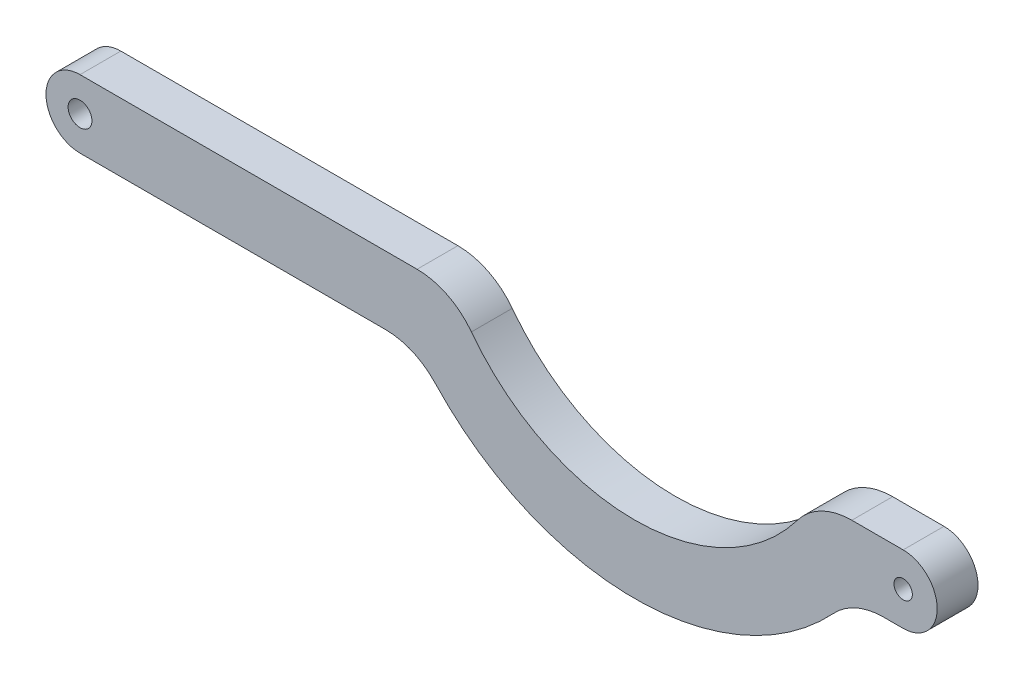
ISO-10303-21;
HEADER;
FILE_DESCRIPTION(('STEP AP214'),'2;1');
FILE_NAME('part.step','',(''),(''),'','','');
FILE_SCHEMA(('AUTOMOTIVE_DESIGN { 1 0 10303 214 1 1 1 1 }'));
ENDSEC;
DATA;
#1=APPLICATION_CONTEXT('core data for automotive mechanical design processes');
#2=APPLICATION_PROTOCOL_DEFINITION('international standard','automotive_design',2000,#1);
#3=PRODUCT_CONTEXT('',#1,'mechanical');
#4=PRODUCT('Part','Part','',(#3));
#5=PRODUCT_RELATED_PRODUCT_CATEGORY('part','',(#4));
#6=PRODUCT_DEFINITION_FORMATION('','',#4);
#7=PRODUCT_DEFINITION_CONTEXT('part definition',#1,'design');
#8=PRODUCT_DEFINITION('design','',#6,#7);
#9=PRODUCT_DEFINITION_SHAPE('','',#8);
#10=(LENGTH_UNIT() NAMED_UNIT(*) SI_UNIT(.MILLI.,.METRE.));
#11=(NAMED_UNIT(*) PLANE_ANGLE_UNIT() SI_UNIT($,.RADIAN.));
#12=(NAMED_UNIT(*) SI_UNIT($,.STERADIAN.) SOLID_ANGLE_UNIT());
#13=UNCERTAINTY_MEASURE_WITH_UNIT(LENGTH_MEASURE(1.E-05),#10,'distance_accuracy_value','');
#14=(GEOMETRIC_REPRESENTATION_CONTEXT(3) GLOBAL_UNCERTAINTY_ASSIGNED_CONTEXT((#13)) GLOBAL_UNIT_ASSIGNED_CONTEXT((#10,
#11,#12)) REPRESENTATION_CONTEXT('',''));
#15=CARTESIAN_POINT('',(0.,0.,0.));
#16=DIRECTION('',(0.,0.,1.));
#17=DIRECTION('',(1.,0.,0.));
#18=AXIS2_PLACEMENT_3D('',#15,#16,#17);
#19=CARTESIAN_POINT('',(0.,5.,6.));
#20=DIRECTION('',(0.,0.,1.));
#21=DIRECTION('',(1.,0.,0.));
#22=AXIS2_PLACEMENT_3D('',#19,#20,#21);
#23=PLANE('',#22);
#24=CARTESIAN_POINT('',(0.,5.,6.));
#25=DIRECTION('',(0.,0.,1.));
#26=DIRECTION('',(1.,0.,0.));
#27=AXIS2_PLACEMENT_3D('',#24,#25,#26);
#28=CIRCLE('',#27,1.75);
#29=CARTESIAN_POINT('',(1.75,5.,6.));
#30=VERTEX_POINT('',#29);
#31=EDGE_CURVE('E254',#30,#30,#28,.T.);
#32=ORIENTED_EDGE('',*,*,#31,.F.);
#33=EDGE_LOOP('',(#32));
#34=FACE_BOUND('',#33,.T.);
#35=DIRECTION('',(-1.,0.,0.));
#36=VECTOR('',#35,1.);
#37=CARTESIAN_POINT('',(108.,10.,6.));
#38=LINE('',#37,#36);
#39=CARTESIAN_POINT('',(121.,10.,6.));
#40=VERTEX_POINT('',#39);
#41=CARTESIAN_POINT('',(113.453134084022,10.,6.));
#42=VERTEX_POINT('',#41);
#43=EDGE_CURVE('E244',#40,#42,#38,.T.);
#44=ORIENTED_EDGE('',*,*,#43,.T.);
#45=CARTESIAN_POINT('',(113.453134084022,0.,6.));
#46=DIRECTION('',(0.,0.,1.));
#47=DIRECTION('',(1.,0.,0.));
#48=AXIS2_PLACEMENT_3D('',#45,#46,#47);
#49=CIRCLE('',#48,10.);
#50=CARTESIAN_POINT('',(105.464850563017,6.01559027760632,6.));
#51=VERTEX_POINT('',#50);
#52=EDGE_CURVE('E193',#42,#51,#49,.T.);
#53=ORIENTED_EDGE('',*,*,#52,.T.);
#54=CARTESIAN_POINT('',(81.5,24.0623611104252,6.));
#55=DIRECTION('',(0.,0.,-1.));
#56=DIRECTION('',(1.,0.,0.));
#57=AXIS2_PLACEMENT_3D('',#54,#55,#56);
#58=CIRCLE('',#57,30.);
#59=CARTESIAN_POINT('',(57.5351494369834,6.01559027760631,6.));
#60=VERTEX_POINT('',#59);
#61=EDGE_CURVE('E247',#51,#60,#58,.T.);
#62=ORIENTED_EDGE('',*,*,#61,.T.);
#63=CARTESIAN_POINT('',(49.5468659159779,0.,6.));
#64=DIRECTION('',(0.,0.,1.));
#65=DIRECTION('',(1.,0.,0.));
#66=AXIS2_PLACEMENT_3D('',#63,#64,#65);
#67=CIRCLE('',#66,10.);
#68=CARTESIAN_POINT('',(49.5468659159779,10.,6.));
#69=VERTEX_POINT('',#68);
#70=EDGE_CURVE('E57',#60,#69,#67,.T.);
#71=ORIENTED_EDGE('',*,*,#70,.T.);
#72=DIRECTION('',(-1.,0.,0.));
#73=VECTOR('',#72,1.);
#74=CARTESIAN_POINT('',(0.,10.,6.));
#75=LINE('',#74,#73);
#76=CARTESIAN_POINT('',(0.,10.,6.));
#77=VERTEX_POINT('',#76);
#78=EDGE_CURVE('E148',#69,#77,#75,.T.);
#79=ORIENTED_EDGE('',*,*,#78,.T.);
#80=CARTESIAN_POINT('',(0.,5.,6.));
#81=DIRECTION('',(0.,0.,1.));
#82=DIRECTION('',(1.,0.,0.));
#83=AXIS2_PLACEMENT_3D('',#80,#81,#82);
#84=CIRCLE('',#83,5.);
#85=CARTESIAN_POINT('',(0.,0.,6.));
#86=VERTEX_POINT('',#85);
#87=EDGE_CURVE('E143',#77,#86,#84,.T.);
#88=ORIENTED_EDGE('',*,*,#87,.T.);
#89=DIRECTION('',(1.,0.,0.));
#90=VECTOR('',#89,1.);
#91=CARTESIAN_POINT('',(0.,0.,6.));
#92=LINE('',#91,#90);
#93=CARTESIAN_POINT('',(44.8973285731357,0.,6.));
#94=VERTEX_POINT('',#93);
#95=EDGE_CURVE('E131',#86,#94,#92,.T.);
#96=ORIENTED_EDGE('',*,*,#95,.T.);
#97=CARTESIAN_POINT('',(44.8973285731357,-10.,6.));
#98=DIRECTION('',(0.,0.,1.));
#99=DIRECTION('',(1.,0.,0.));
#100=AXIS2_PLACEMENT_3D('',#97,#98,#99);
#101=CIRCLE('',#100,10.);
#102=CARTESIAN_POINT('',(52.2178628585085,-3.18752777791495,6.));
#103=VERTEX_POINT('',#102);
#104=EDGE_CURVE('E11',#94,#103,#101,.F.);
#105=ORIENTED_EDGE('',*,*,#104,.T.);
#106=CARTESIAN_POINT('',(81.5,24.0623611104252,6.));
#107=DIRECTION('',(0.,0.,1.));
#108=DIRECTION('',(1.,0.,0.));
#109=AXIS2_PLACEMENT_3D('',#106,#107,#108);
#110=CIRCLE('',#109,40.);
#111=CARTESIAN_POINT('',(110.782137141491,-3.18752777791495,6.));
#112=VERTEX_POINT('',#111);
#113=EDGE_CURVE('E142',#103,#112,#110,.T.);
#114=ORIENTED_EDGE('',*,*,#113,.T.);
#115=CARTESIAN_POINT('',(118.102671426864,-10.,6.));
#116=DIRECTION('',(0.,0.,1.));
#117=DIRECTION('',(1.,0.,0.));
#118=AXIS2_PLACEMENT_3D('',#115,#116,#117);
#119=CIRCLE('',#118,10.);
#120=CARTESIAN_POINT('',(118.102671426864,0.,6.));
#121=VERTEX_POINT('',#120);
#122=EDGE_CURVE('E64',#112,#121,#119,.F.);
#123=ORIENTED_EDGE('',*,*,#122,.T.);
#124=DIRECTION('',(1.,0.,0.));
#125=VECTOR('',#124,1.);
#126=CARTESIAN_POINT('',(113.453134084022,0.,6.));
#127=LINE('',#126,#125);
#128=CARTESIAN_POINT('',(121.,0.,6.));
#129=VERTEX_POINT('',#128);
#130=EDGE_CURVE('E236',#121,#129,#127,.T.);
#131=ORIENTED_EDGE('',*,*,#130,.T.);
#132=CARTESIAN_POINT('',(121.,5.,6.));
#133=DIRECTION('',(0.,0.,1.));
#134=DIRECTION('',(-1.,0.,0.));
#135=AXIS2_PLACEMENT_3D('',#132,#133,#134);
#136=CIRCLE('',#135,5.);
#137=EDGE_CURVE('E239',#129,#40,#136,.T.);
#138=ORIENTED_EDGE('',*,*,#137,.T.);
#139=EDGE_LOOP('',(#44,#53,#62,#71,#79,#88,#96,#105,#114,#123,#131,#138));
#140=FACE_BOUND('',#139,.T.);
#141=CARTESIAN_POINT('',(121.,5.,6.));
#142=DIRECTION('',(0.,0.,1.));
#143=DIRECTION('',(1.,0.,0.));
#144=AXIS2_PLACEMENT_3D('',#141,#142,#143);
#145=CIRCLE('',#144,1.35000000000001);
#146=CARTESIAN_POINT('',(122.35,5.,6.));
#147=VERTEX_POINT('',#146);
#148=EDGE_CURVE('E332',#147,#147,#145,.T.);
#149=ORIENTED_EDGE('',*,*,#148,.F.);
#150=EDGE_LOOP('',(#149));
#151=FACE_BOUND('',#150,.T.);
#152=ADVANCED_FACE('F41',(#34,#140,#151),#23,.T.);
#153=CARTESIAN_POINT('',(0.,5.,0.));
#154=DIRECTION('',(0.,0.,1.));
#155=DIRECTION('',(1.,0.,0.));
#156=AXIS2_PLACEMENT_3D('',#153,#154,#155);
#157=PLANE('',#156);
#158=CARTESIAN_POINT('',(0.,5.,0.));
#159=DIRECTION('',(0.,0.,1.));
#160=DIRECTION('',(1.,0.,0.));
#161=AXIS2_PLACEMENT_3D('',#158,#159,#160);
#162=CIRCLE('',#161,3.);
#163=CARTESIAN_POINT('',(3.,5.,0.));
#164=VERTEX_POINT('',#163);
#165=EDGE_CURVE('E159',#164,#164,#162,.T.);
#166=ORIENTED_EDGE('',*,*,#165,.T.);
#167=EDGE_LOOP('',(#166));
#168=FACE_BOUND('',#167,.T.);
#169=CARTESIAN_POINT('',(81.5,24.0623611104252,0.));
#170=DIRECTION('',(0.,0.,-1.));
#171=DIRECTION('',(1.,0.,0.));
#172=AXIS2_PLACEMENT_3D('',#169,#170,#171);
#173=CIRCLE('',#172,30.);
#174=CARTESIAN_POINT('',(105.464850563017,6.01559027760632,0.));
#175=VERTEX_POINT('',#174);
#176=CARTESIAN_POINT('',(57.5351494369834,6.01559027760631,0.));
#177=VERTEX_POINT('',#176);
#178=EDGE_CURVE('E268',#175,#177,#173,.T.);
#179=ORIENTED_EDGE('',*,*,#178,.F.);
#180=CARTESIAN_POINT('',(113.453134084022,0.,0.));
#181=DIRECTION('',(0.,0.,1.));
#182=DIRECTION('',(1.,0.,0.));
#183=AXIS2_PLACEMENT_3D('',#180,#181,#182);
#184=CIRCLE('',#183,10.);
#185=CARTESIAN_POINT('',(113.453134084022,10.,0.));
#186=VERTEX_POINT('',#185);
#187=EDGE_CURVE('E185',#175,#186,#184,.F.);
#188=ORIENTED_EDGE('',*,*,#187,.T.);
#189=DIRECTION('',(-1.,0.,0.));
#190=VECTOR('',#189,1.);
#191=CARTESIAN_POINT('',(108.,10.,0.));
#192=LINE('',#191,#190);
#193=CARTESIAN_POINT('',(121.,10.,0.));
#194=VERTEX_POINT('',#193);
#195=EDGE_CURVE('E264',#194,#186,#192,.T.);
#196=ORIENTED_EDGE('',*,*,#195,.F.);
#197=CARTESIAN_POINT('',(121.,5.,0.));
#198=DIRECTION('',(0.,0.,1.));
#199=DIRECTION('',(-1.,0.,0.));
#200=AXIS2_PLACEMENT_3D('',#197,#198,#199);
#201=CIRCLE('',#200,5.);
#202=CARTESIAN_POINT('',(121.,0.,0.));
#203=VERTEX_POINT('',#202);
#204=EDGE_CURVE('E261',#203,#194,#201,.T.);
#205=ORIENTED_EDGE('',*,*,#204,.F.);
#206=DIRECTION('',(1.,0.,0.));
#207=VECTOR('',#206,1.);
#208=CARTESIAN_POINT('',(113.453134084022,0.,0.));
#209=LINE('',#208,#207);
#210=CARTESIAN_POINT('',(118.102671426864,0.,0.));
#211=VERTEX_POINT('',#210);
#212=EDGE_CURVE('E258',#211,#203,#209,.T.);
#213=ORIENTED_EDGE('',*,*,#212,.F.);
#214=CARTESIAN_POINT('',(118.102671426864,-10.,0.));
#215=DIRECTION('',(0.,0.,1.));
#216=DIRECTION('',(1.,0.,0.));
#217=AXIS2_PLACEMENT_3D('',#214,#215,#216);
#218=CIRCLE('',#217,10.);
#219=CARTESIAN_POINT('',(110.782137141491,-3.18752777791495,0.));
#220=VERTEX_POINT('',#219);
#221=EDGE_CURVE('E213',#211,#220,#218,.T.);
#222=ORIENTED_EDGE('',*,*,#221,.T.);
#223=CARTESIAN_POINT('',(81.5,24.0623611104252,0.));
#224=DIRECTION('',(0.,0.,1.));
#225=DIRECTION('',(1.,0.,0.));
#226=AXIS2_PLACEMENT_3D('',#223,#224,#225);
#227=CIRCLE('',#226,40.);
#228=CARTESIAN_POINT('',(52.2178628585085,-3.18752777791495,0.));
#229=VERTEX_POINT('',#228);
#230=EDGE_CURVE('E225',#229,#220,#227,.T.);
#231=ORIENTED_EDGE('',*,*,#230,.F.);
#232=CARTESIAN_POINT('',(44.8973285731357,-10.,0.));
#233=DIRECTION('',(0.,0.,1.));
#234=DIRECTION('',(1.,0.,0.));
#235=AXIS2_PLACEMENT_3D('',#232,#233,#234);
#236=CIRCLE('',#235,10.);
#237=CARTESIAN_POINT('',(44.8973285731357,0.,0.));
#238=VERTEX_POINT('',#237);
#239=EDGE_CURVE('E50',#229,#238,#236,.T.);
#240=ORIENTED_EDGE('',*,*,#239,.T.);
#241=DIRECTION('',(1.,0.,0.));
#242=VECTOR('',#241,1.);
#243=CARTESIAN_POINT('',(0.,0.,0.));
#244=LINE('',#243,#242);
#245=CARTESIAN_POINT('',(0.,0.,0.));
#246=VERTEX_POINT('',#245);
#247=EDGE_CURVE('E223',#246,#238,#244,.T.);
#248=ORIENTED_EDGE('',*,*,#247,.F.);
#249=CARTESIAN_POINT('',(0.,5.,0.));
#250=DIRECTION('',(0.,0.,1.));
#251=DIRECTION('',(1.,0.,0.));
#252=AXIS2_PLACEMENT_3D('',#249,#250,#251);
#253=CIRCLE('',#252,5.);
#254=CARTESIAN_POINT('',(0.,10.,0.));
#255=VERTEX_POINT('',#254);
#256=EDGE_CURVE('E157',#255,#246,#253,.T.);
#257=ORIENTED_EDGE('',*,*,#256,.F.);
#258=DIRECTION('',(-1.,0.,0.));
#259=VECTOR('',#258,1.);
#260=CARTESIAN_POINT('',(0.,10.,0.));
#261=LINE('',#260,#259);
#262=CARTESIAN_POINT('',(49.5468659159779,10.,0.));
#263=VERTEX_POINT('',#262);
#264=EDGE_CURVE('E153',#263,#255,#261,.T.);
#265=ORIENTED_EDGE('',*,*,#264,.F.);
#266=CARTESIAN_POINT('',(49.5468659159779,0.,0.));
#267=DIRECTION('',(0.,0.,1.));
#268=DIRECTION('',(1.,0.,0.));
#269=AXIS2_PLACEMENT_3D('',#266,#267,#268);
#270=CIRCLE('',#269,10.);
#271=EDGE_CURVE('E182',#263,#177,#270,.F.);
#272=ORIENTED_EDGE('',*,*,#271,.T.);
#273=EDGE_LOOP('',(#179,#188,#196,#205,#213,#222,#231,#240,#248,#257,#265,#272));
#274=FACE_BOUND('',#273,.T.);
#275=CARTESIAN_POINT('',(121.,5.,0.));
#276=DIRECTION('',(0.,0.,1.));
#277=DIRECTION('',(1.,0.,0.));
#278=AXIS2_PLACEMENT_3D('',#275,#276,#277);
#279=CIRCLE('',#278,1.35000000000001);
#280=CARTESIAN_POINT('',(122.35,5.,0.));
#281=VERTEX_POINT('',#280);
#282=EDGE_CURVE('E335',#281,#281,#279,.T.);
#283=ORIENTED_EDGE('',*,*,#282,.T.);
#284=EDGE_LOOP('',(#283));
#285=FACE_BOUND('',#284,.T.);
#286=ADVANCED_FACE('F221',(#168,#274,#285),#157,.F.);
#287=CARTESIAN_POINT('',(0.,5.,6.));
#288=DIRECTION('',(0.,0.,-1.));
#289=DIRECTION('',(-1.,0.,0.));
#290=AXIS2_PLACEMENT_3D('',#287,#288,#289);
#291=CYLINDRICAL_SURFACE('',#290,5.);
#292=ORIENTED_EDGE('',*,*,#256,.T.);
#293=DIRECTION('',(0.,0.,-1.));
#294=VECTOR('',#293,1.);
#295=CARTESIAN_POINT('',(0.,0.,6.));
#296=LINE('',#295,#294);
#297=EDGE_CURVE('E136',#86,#246,#296,.T.);
#298=ORIENTED_EDGE('',*,*,#297,.F.);
#299=ORIENTED_EDGE('',*,*,#87,.F.);
#300=DIRECTION('',(0.,0.,-1.));
#301=VECTOR('',#300,1.);
#302=CARTESIAN_POINT('',(0.,10.,6.));
#303=LINE('',#302,#301);
#304=EDGE_CURVE('E252',#77,#255,#303,.T.);
#305=ORIENTED_EDGE('',*,*,#304,.T.);
#306=EDGE_LOOP('',(#292,#298,#299,#305));
#307=FACE_BOUND('',#306,.T.);
#308=ADVANCED_FACE('F155',(#307),#291,.T.);
#309=CARTESIAN_POINT('',(0.,0.,6.));
#310=DIRECTION('',(0.,1.,0.));
#311=DIRECTION('',(0.,0.,1.));
#312=AXIS2_PLACEMENT_3D('',#309,#310,#311);
#313=PLANE('',#312);
#314=ORIENTED_EDGE('',*,*,#247,.T.);
#315=DIRECTION('',(0.,0.,1.));
#316=VECTOR('',#315,1.);
#317=CARTESIAN_POINT('',(44.8973285731357,0.,6.));
#318=LINE('',#317,#316);
#319=EDGE_CURVE('E139',#238,#94,#318,.T.);
#320=ORIENTED_EDGE('',*,*,#319,.T.);
#321=ORIENTED_EDGE('',*,*,#95,.F.);
#322=ORIENTED_EDGE('',*,*,#297,.T.);
#323=EDGE_LOOP('',(#314,#320,#321,#322));
#324=FACE_BOUND('',#323,.T.);
#325=ADVANCED_FACE('F134',(#324),#313,.F.);
#326=CARTESIAN_POINT('',(81.5,24.0623611104252,6.));
#327=DIRECTION('',(0.,0.,-1.));
#328=DIRECTION('',(-1.,0.,0.));
#329=AXIS2_PLACEMENT_3D('',#326,#327,#328);
#330=CYLINDRICAL_SURFACE('',#329,40.);
#331=ORIENTED_EDGE('',*,*,#230,.T.);
#332=DIRECTION('',(0.,0.,-1.));
#333=VECTOR('',#332,1.);
#334=CARTESIAN_POINT('',(110.782137141491,-3.18752777791495,6.));
#335=LINE('',#334,#333);
#336=EDGE_CURVE('E204',#220,#112,#335,.F.);
#337=ORIENTED_EDGE('',*,*,#336,.T.);
#338=ORIENTED_EDGE('',*,*,#113,.F.);
#339=DIRECTION('',(0.,0.,-1.));
#340=VECTOR('',#339,1.);
#341=CARTESIAN_POINT('',(52.2178628585085,-3.18752777791495,6.));
#342=LINE('',#341,#340);
#343=EDGE_CURVE('E200',#103,#229,#342,.T.);
#344=ORIENTED_EDGE('',*,*,#343,.T.);
#345=EDGE_LOOP('',(#331,#337,#338,#344));
#346=FACE_BOUND('',#345,.T.);
#347=ADVANCED_FACE('F233',(#346),#330,.T.);
#348=CARTESIAN_POINT('',(113.453134084022,0.,6.));
#349=DIRECTION('',(0.,1.,0.));
#350=DIRECTION('',(0.,0.,1.));
#351=AXIS2_PLACEMENT_3D('',#348,#349,#350);
#352=PLANE('',#351);
#353=ORIENTED_EDGE('',*,*,#130,.F.);
#354=DIRECTION('',(0.,0.,1.));
#355=VECTOR('',#354,1.);
#356=CARTESIAN_POINT('',(118.102671426864,0.,0.));
#357=LINE('',#356,#355);
#358=EDGE_CURVE('E196',#121,#211,#357,.F.);
#359=ORIENTED_EDGE('',*,*,#358,.T.);
#360=ORIENTED_EDGE('',*,*,#212,.T.);
#361=DIRECTION('',(0.,0.,-1.));
#362=VECTOR('',#361,1.);
#363=CARTESIAN_POINT('',(121.,0.,6.));
#364=LINE('',#363,#362);
#365=EDGE_CURVE('E160',#129,#203,#364,.T.);
#366=ORIENTED_EDGE('',*,*,#365,.F.);
#367=EDGE_LOOP('',(#353,#359,#360,#366));
#368=FACE_BOUND('',#367,.T.);
#369=ADVANCED_FACE('F409',(#368),#352,.F.);
#370=CARTESIAN_POINT('',(121.,5.,6.));
#371=DIRECTION('',(0.,0.,-1.));
#372=DIRECTION('',(-1.,0.,0.));
#373=AXIS2_PLACEMENT_3D('',#370,#371,#372);
#374=CYLINDRICAL_SURFACE('',#373,5.);
#375=ORIENTED_EDGE('',*,*,#204,.T.);
#376=DIRECTION('',(0.,0.,-1.));
#377=VECTOR('',#376,1.);
#378=CARTESIAN_POINT('',(121.,10.,6.));
#379=LINE('',#378,#377);
#380=EDGE_CURVE('E168',#40,#194,#379,.T.);
#381=ORIENTED_EDGE('',*,*,#380,.F.);
#382=ORIENTED_EDGE('',*,*,#137,.F.);
#383=ORIENTED_EDGE('',*,*,#365,.T.);
#384=EDGE_LOOP('',(#375,#381,#382,#383));
#385=FACE_BOUND('',#384,.T.);
#386=ADVANCED_FACE('F402',(#385),#374,.T.);
#387=CARTESIAN_POINT('',(108.,10.,6.));
#388=DIRECTION('',(0.,-1.,0.));
#389=DIRECTION('',(1.,0.,0.));
#390=AXIS2_PLACEMENT_3D('',#387,#388,#389);
#391=PLANE('',#390);
#392=ORIENTED_EDGE('',*,*,#195,.T.);
#393=DIRECTION('',(0.,0.,-1.));
#394=VECTOR('',#393,1.);
#395=CARTESIAN_POINT('',(113.453134084022,10.,6.));
#396=LINE('',#395,#394);
#397=EDGE_CURVE('E188',#186,#42,#396,.F.);
#398=ORIENTED_EDGE('',*,*,#397,.T.);
#399=ORIENTED_EDGE('',*,*,#43,.F.);
#400=ORIENTED_EDGE('',*,*,#380,.T.);
#401=EDGE_LOOP('',(#392,#398,#399,#400));
#402=FACE_BOUND('',#401,.T.);
#403=ADVANCED_FACE('F281',(#402),#391,.F.);
#404=CARTESIAN_POINT('',(81.5,24.0623611104252,6.));
#405=DIRECTION('',(0.,0.,-1.));
#406=DIRECTION('',(-1.,0.,0.));
#407=AXIS2_PLACEMENT_3D('',#404,#405,#406);
#408=CYLINDRICAL_SURFACE('',#407,30.);
#409=ORIENTED_EDGE('',*,*,#61,.F.);
#410=DIRECTION('',(0.,0.,-1.));
#411=VECTOR('',#410,1.);
#412=CARTESIAN_POINT('',(105.464850563017,6.01559027760631,6.));
#413=LINE('',#412,#411);
#414=EDGE_CURVE('E178',#51,#175,#413,.T.);
#415=ORIENTED_EDGE('',*,*,#414,.T.);
#416=ORIENTED_EDGE('',*,*,#178,.T.);
#417=DIRECTION('',(0.,0.,-1.));
#418=VECTOR('',#417,1.);
#419=CARTESIAN_POINT('',(57.5351494369834,6.01559027760631,6.));
#420=LINE('',#419,#418);
#421=EDGE_CURVE('E175',#177,#60,#420,.F.);
#422=ORIENTED_EDGE('',*,*,#421,.T.);
#423=EDGE_LOOP('',(#409,#415,#416,#422));
#424=FACE_BOUND('',#423,.T.);
#425=ADVANCED_FACE('F293',(#424),#408,.F.);
#426=CARTESIAN_POINT('',(0.,10.,6.));
#427=DIRECTION('',(0.,-1.,0.));
#428=DIRECTION('',(0.,0.,-1.));
#429=AXIS2_PLACEMENT_3D('',#426,#427,#428);
#430=PLANE('',#429);
#431=ORIENTED_EDGE('',*,*,#78,.F.);
#432=DIRECTION('',(0.,0.,-1.));
#433=VECTOR('',#432,1.);
#434=CARTESIAN_POINT('',(49.5468659159779,10.,6.));
#435=LINE('',#434,#433);
#436=EDGE_CURVE('E209',#69,#263,#435,.T.);
#437=ORIENTED_EDGE('',*,*,#436,.T.);
#438=ORIENTED_EDGE('',*,*,#264,.T.);
#439=ORIENTED_EDGE('',*,*,#304,.F.);
#440=EDGE_LOOP('',(#431,#437,#438,#439));
#441=FACE_BOUND('',#440,.T.);
#442=ADVANCED_FACE('F299',(#441),#430,.F.);
#443=CARTESIAN_POINT('',(0.,5.,6.));
#444=DIRECTION('',(0.,0.,-1.));
#445=DIRECTION('',(-1.,0.,0.));
#446=AXIS2_PLACEMENT_3D('',#443,#444,#445);
#447=CYLINDRICAL_SURFACE('',#446,1.75);
#448=CARTESIAN_POINT('',(0.,5.,1.25000000000001));
#449=DIRECTION('',(0.,0.,1.));
#450=DIRECTION('',(1.,0.,0.));
#451=AXIS2_PLACEMENT_3D('',#448,#449,#450);
#452=CIRCLE('',#451,1.75);
#453=CARTESIAN_POINT('',(1.75,5.,1.25000000000001));
#454=VERTEX_POINT('',#453);
#455=EDGE_CURVE('E165',#454,#454,#452,.F.);
#456=ORIENTED_EDGE('',*,*,#455,.T.);
#457=EDGE_LOOP('',(#456));
#458=FACE_BOUND('',#457,.T.);
#459=ORIENTED_EDGE('',*,*,#31,.T.);
#460=EDGE_LOOP('',(#459));
#461=FACE_BOUND('',#460,.T.);
#462=ADVANCED_FACE('F301',(#458,#461),#447,.F.);
#463=CARTESIAN_POINT('',(121.,5.,6.));
#464=DIRECTION('',(0.,0.,-1.));
#465=DIRECTION('',(-1.,0.,0.));
#466=AXIS2_PLACEMENT_3D('',#463,#464,#465);
#467=CYLINDRICAL_SURFACE('',#466,1.35000000000001);
#468=ORIENTED_EDGE('',*,*,#148,.T.);
#469=EDGE_LOOP('',(#468));
#470=FACE_BOUND('',#469,.T.);
#471=ORIENTED_EDGE('',*,*,#282,.F.);
#472=EDGE_LOOP('',(#471));
#473=FACE_BOUND('',#472,.T.);
#474=ADVANCED_FACE('F307',(#470,#473),#467,.F.);
#475=CARTESIAN_POINT('',(0.,5.,0.));
#476=DIRECTION('',(0.,0.,-1.));
#477=DIRECTION('',(-1.,0.,0.));
#478=AXIS2_PLACEMENT_3D('',#475,#476,#477);
#479=CONICAL_SURFACE('',#478,3.,0.785398163397445);
#480=ORIENTED_EDGE('',*,*,#455,.F.);
#481=EDGE_LOOP('',(#480));
#482=FACE_BOUND('',#481,.T.);
#483=ORIENTED_EDGE('',*,*,#165,.F.);
#484=EDGE_LOOP('',(#483));
#485=FACE_BOUND('',#484,.T.);
#486=ADVANCED_FACE('F322',(#482,#485),#479,.F.);
#487=CARTESIAN_POINT('',(113.453134084022,0.,6.));
#488=DIRECTION('',(0.,0.,-1.));
#489=DIRECTION('',(-1.,0.,0.));
#490=AXIS2_PLACEMENT_3D('',#487,#488,#489);
#491=CYLINDRICAL_SURFACE('',#490,10.);
#492=ORIENTED_EDGE('',*,*,#52,.F.);
#493=ORIENTED_EDGE('',*,*,#397,.F.);
#494=ORIENTED_EDGE('',*,*,#187,.F.);
#495=ORIENTED_EDGE('',*,*,#414,.F.);
#496=EDGE_LOOP('',(#492,#493,#494,#495));
#497=FACE_BOUND('',#496,.T.);
#498=ADVANCED_FACE('F290',(#497),#491,.T.);
#499=CARTESIAN_POINT('',(118.102671426864,-10.,6.));
#500=DIRECTION('',(0.,0.,-1.));
#501=DIRECTION('',(-1.,0.,0.));
#502=AXIS2_PLACEMENT_3D('',#499,#500,#501);
#503=CYLINDRICAL_SURFACE('',#502,10.);
#504=ORIENTED_EDGE('',*,*,#122,.F.);
#505=ORIENTED_EDGE('',*,*,#336,.F.);
#506=ORIENTED_EDGE('',*,*,#221,.F.);
#507=ORIENTED_EDGE('',*,*,#358,.F.);
#508=EDGE_LOOP('',(#504,#505,#506,#507));
#509=FACE_BOUND('',#508,.T.);
#510=ADVANCED_FACE('F347',(#509),#503,.F.);
#511=CARTESIAN_POINT('',(44.8973285731357,-10.,6.));
#512=DIRECTION('',(0.,0.,-1.));
#513=DIRECTION('',(-1.,0.,0.));
#514=AXIS2_PLACEMENT_3D('',#511,#512,#513);
#515=CYLINDRICAL_SURFACE('',#514,10.);
#516=ORIENTED_EDGE('',*,*,#104,.F.);
#517=ORIENTED_EDGE('',*,*,#319,.F.);
#518=ORIENTED_EDGE('',*,*,#239,.F.);
#519=ORIENTED_EDGE('',*,*,#343,.F.);
#520=EDGE_LOOP('',(#516,#517,#518,#519));
#521=FACE_BOUND('',#520,.T.);
#522=ADVANCED_FACE('F230',(#521),#515,.F.);
#523=CARTESIAN_POINT('',(49.5468659159779,0.,6.));
#524=DIRECTION('',(0.,0.,-1.));
#525=DIRECTION('',(-1.,0.,0.));
#526=AXIS2_PLACEMENT_3D('',#523,#524,#525);
#527=CYLINDRICAL_SURFACE('',#526,10.);
#528=ORIENTED_EDGE('',*,*,#70,.F.);
#529=ORIENTED_EDGE('',*,*,#421,.F.);
#530=ORIENTED_EDGE('',*,*,#271,.F.);
#531=ORIENTED_EDGE('',*,*,#436,.F.);
#532=EDGE_LOOP('',(#528,#529,#530,#531));
#533=FACE_BOUND('',#532,.T.);
#534=ADVANCED_FACE('F43',(#533),#527,.T.);
#535=CLOSED_SHELL('',(#152,#286,#308,#325,#347,#369,#386,#403,#425,#442,#462,#474,#486,#498,
#510,#522,#534));
#536=MANIFOLD_SOLID_BREP('B2',#535);
#537=ADVANCED_BREP_SHAPE_REPRESENTATION('',(#18,#536),#14);
#538=SHAPE_DEFINITION_REPRESENTATION(#9,#537);
ENDSEC;
END-ISO-10303-21;
